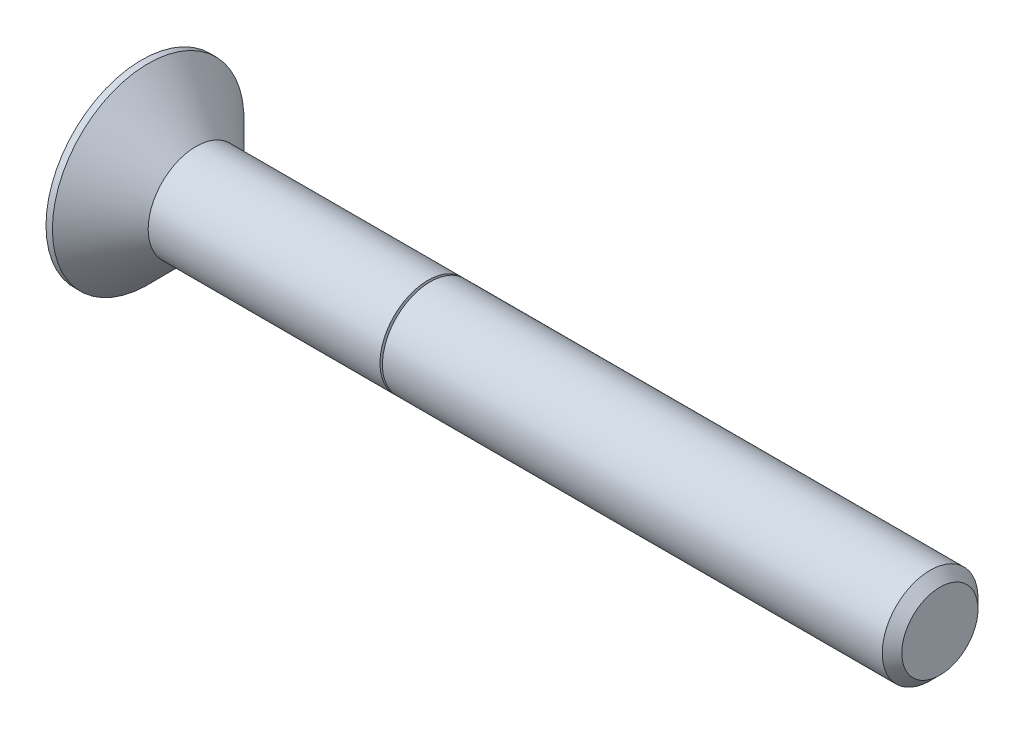
ISO-10303-21;
HEADER;
FILE_DESCRIPTION(('STEP AP214'),'2;1');
FILE_NAME('part.step','',(''),(''),'','','');
FILE_SCHEMA(('AUTOMOTIVE_DESIGN { 1 0 10303 214 1 1 1 1 }'));
ENDSEC;
DATA;
#1=APPLICATION_CONTEXT('core data for automotive mechanical design processes');
#2=APPLICATION_PROTOCOL_DEFINITION('international standard','automotive_design',2000,#1);
#3=PRODUCT_CONTEXT('',#1,'mechanical');
#4=PRODUCT('Part','Part','',(#3));
#5=PRODUCT_RELATED_PRODUCT_CATEGORY('part','',(#4));
#6=PRODUCT_DEFINITION_FORMATION('','',#4);
#7=PRODUCT_DEFINITION_CONTEXT('part definition',#1,'design');
#8=PRODUCT_DEFINITION('design','',#6,#7);
#9=PRODUCT_DEFINITION_SHAPE('','',#8);
#10=(LENGTH_UNIT() NAMED_UNIT(*) SI_UNIT(.MILLI.,.METRE.));
#11=(NAMED_UNIT(*) PLANE_ANGLE_UNIT() SI_UNIT($,.RADIAN.));
#12=(NAMED_UNIT(*) SI_UNIT($,.STERADIAN.) SOLID_ANGLE_UNIT());
#13=UNCERTAINTY_MEASURE_WITH_UNIT(LENGTH_MEASURE(1.E-05),#10,'distance_accuracy_value','');
#14=(GEOMETRIC_REPRESENTATION_CONTEXT(3) GLOBAL_UNCERTAINTY_ASSIGNED_CONTEXT((#13)) GLOBAL_UNIT_ASSIGNED_CONTEXT((#10,
#11,#12)) REPRESENTATION_CONTEXT('',''));
#15=CARTESIAN_POINT('',(0.,0.,0.));
#16=DIRECTION('',(0.,0.,1.));
#17=DIRECTION('',(1.,0.,0.));
#18=AXIS2_PLACEMENT_3D('',#15,#16,#17);
#19=CARTESIAN_POINT('',(1.19599999993625,0.,0.));
#20=DIRECTION('',(-1.,0.,0.));
#21=DIRECTION('',(0.,0.,1.));
#22=AXIS2_PLACEMENT_3D('',#19,#20,#21);
#23=CONICAL_SURFACE('',#22,1.16162874155634,1.04719755114781);
#24=CARTESIAN_POINT('',(1.19999999991991,2.55681404529271E-11,-1.15470053837725));
#25=CARTESIAN_POINT('',(1.21465222735329,0.0439439438040492,-1.12932949059931));
#26=CARTESIAN_POINT('',(1.22797766136562,0.0882672110816893,-1.10373944030185));
#27=CARTESIAN_POINT('',(1.25123680621567,0.17768117336278,-1.05211626510709));
#28=CARTESIAN_POINT('',(1.26116228974773,0.222773456562144,-1.02608222326447));
#29=CARTESIAN_POINT('',(1.27661202044451,0.312399216899071,-0.974336766408263));
#30=CARTESIAN_POINT('',(1.28223910611895,0.356918907827556,-0.94863331086623));
#31=CARTESIAN_POINT('',(1.28895541585153,0.446167660249827,-0.897105519630224));
#32=CARTESIAN_POINT('',(1.29005020292915,0.490896397571249,-0.871281371097252));
#33=CARTESIAN_POINT('',(1.28776685483754,0.57446724487014,-0.823031719912872));
#34=CARTESIAN_POINT('',(1.2849493573063,0.613321895334097,-0.800598977008224));
#35=CARTESIAN_POINT('',(1.27602134955453,0.690778070888351,-0.755879633201566));
#36=CARTESIAN_POINT('',(1.26990779252896,0.729379328278377,-0.73359318685638));
#37=CARTESIAN_POINT('',(1.25462508324365,0.806995070858899,-0.688781716984166));
#38=CARTESIAN_POINT('',(1.2453911788035,0.845999737685245,-0.666262362092323));
#39=CARTESIAN_POINT('',(1.22443411949278,0.923427484989556,-0.621559431343431));
#40=CARTESIAN_POINT('',(1.21271588553632,0.961851556641273,-0.59937528323195));
#41=CARTESIAN_POINT('',(1.19999999991243,0.999999999980699,-0.577350269200768));
#42=B_SPLINE_CURVE_WITH_KNOTS('',3,(#24,#25,#26,#27,#28,#29,#30,#31,#32,#33,#34,#35,#36,#37,#38,
#39,#40,#41),.UNSPECIFIED.,.F.,.F.,(4,2,2,2,2,2,2,2,4),(0.,0.15850800577775,0.317396908512481,
0.472353803074594,0.627120444446123,0.761853891302592,0.89671209687333,1.03456081120984,
1.17213898671229),.UNSPECIFIED.);
#43=CARTESIAN_POINT('',(1.19999999994811,1.08570198179951E-11,-1.15470053834804));
#44=VERTEX_POINT('',#43);
#45=CARTESIAN_POINT('',(1.19999999990961,1.,-0.5773502691771));
#46=VERTEX_POINT('',#45);
#47=EDGE_CURVE('E99',#44,#46,#42,.T.);
#48=ORIENTED_EDGE('',*,*,#47,.F.);
#49=CARTESIAN_POINT('',(1.19999999992372,-0.999999999989617,-0.577350269215681));
#50=CARTESIAN_POINT('',(1.21465222735454,-0.956056056201785,-0.602721316977984));
#51=CARTESIAN_POINT('',(1.22797766136577,-0.911732788920495,-0.628311367268926));
#52=CARTESIAN_POINT('',(1.25123680621498,-0.8223188266371,-0.679934542458689));
#53=CARTESIAN_POINT('',(1.26116228974729,-0.777226543439091,-0.705968584302857));
#54=CARTESIAN_POINT('',(1.2766120204443,-0.68760078310344,-0.757714041159983));
#55=CARTESIAN_POINT('',(1.28223910611871,-0.643081092174908,-0.783417496701443));
#56=CARTESIAN_POINT('',(1.28895541585138,-0.553832339752905,-0.834945287936858));
#57=CARTESIAN_POINT('',(1.29005020292912,-0.509103602431797,-0.860769436469812));
#58=CARTESIAN_POINT('',(1.28776685483773,-0.425532755132977,-0.909019087654253));
#59=CARTESIAN_POINT('',(1.28494935730656,-0.386678104668792,-0.931451830558998));
#60=CARTESIAN_POINT('',(1.27602134955489,-0.309221929114091,-0.976171174365888));
#61=CARTESIAN_POINT('',(1.26990779252935,-0.270620671723846,-0.998457620711209));
#62=CARTESIAN_POINT('',(1.25462508324406,-0.19300492914291,-1.04326909058367));
#63=CARTESIAN_POINT('',(1.2453911788039,-0.154000262316369,-1.06578844547562));
#64=CARTESIAN_POINT('',(1.22443411949315,-0.0765725150116841,-1.11049137622473));
#65=CARTESIAN_POINT('',(1.21271588553665,-0.0381484433597894,-1.13267552433631));
#66=CARTESIAN_POINT('',(1.19999999991272,-2.01907872125557E-11,-1.15470053836759));
#67=B_SPLINE_CURVE_WITH_KNOTS('',3,(#49,#50,#51,#52,#53,#54,#55,#56,#57,#58,#59,#60,#61,#62,#63,
#64,#65,#66),.UNSPECIFIED.,.F.,.F.,(4,2,2,2,2,2,2,2,4),(0.,0.158508005776644,0.317396908510391,
0.472353803071736,0.627120444442445,0.761853891299633,0.896712096871121,1.03456081120829,
1.17213898671135),.UNSPECIFIED.);
#68=CARTESIAN_POINT('',(1.19999999991322,-0.999999999989153,-0.577350269183364));
#69=VERTEX_POINT('',#68);
#70=EDGE_CURVE('E127',#69,#44,#67,.T.);
#71=ORIENTED_EDGE('',*,*,#70,.F.);
#72=CARTESIAN_POINT('',(1.19999999992372,-1.00000000001737,0.577350269167606));
#73=CARTESIAN_POINT('',(1.21465222735454,-1.00000000000624,0.526608173623716));
#74=CARTESIAN_POINT('',(1.22797766136577,-1.00000000000167,0.47542807303392));
#75=CARTESIAN_POINT('',(1.25123680621498,-0.999999999998324,0.372181722648594));
#76=CARTESIAN_POINT('',(1.26116228974729,-0.999999999999556,0.320113638962392));
#77=CARTESIAN_POINT('',(1.2766120204443,-1.00000000000043,0.216622725249659));
#78=CARTESIAN_POINT('',(1.28223910611871,-1.00000000000012,0.165215814166189));
#79=CARTESIAN_POINT('',(1.28895541585138,-0.999999999999885,0.0621602316949598));
#80=CARTESIAN_POINT('',(1.29005020292912,-0.999999999999971,0.0105119346292025));
#81=CARTESIAN_POINT('',(1.28776685483772,-1.00000000000002,-0.0859873677396719));
#82=CARTESIAN_POINT('',(1.28494935730655,-1.00000000000001,-0.130852853549281));
#83=CARTESIAN_POINT('',(1.27602134955485,-0.999999999999993,-0.220291541163256));
#84=CARTESIAN_POINT('',(1.26990779252929,-0.999999999999998,-0.264864433853975));
#85=CARTESIAN_POINT('',(1.25462508324395,-1.,-0.354487373599062));
#86=CARTESIAN_POINT('',(1.24539117880376,-1.,-0.399526083383059));
#87=CARTESIAN_POINT('',(1.22443411949293,-0.999999999999999,-0.488931944881441));
#88=CARTESIAN_POINT('',(1.2127158855364,-0.999999999999998,-0.53330024110469));
#89=CARTESIAN_POINT('',(1.19999999991243,-1.,-0.577350269167339));
#90=B_SPLINE_CURVE_WITH_KNOTS('',3,(#72,#73,#74,#75,#76,#77,#78,#79,#80,#81,#82,#83,#84,#85,#86,
#87,#88,#89),.UNSPECIFIED.,.F.,.F.,(4,2,2,2,2,2,2,2,4),(0.,0.158508005776645,0.317396908510393,
0.472353803071737,0.627120444442445,0.761853891299893,0.896712096871642,1.03456081120909,
1.17213898671242),.UNSPECIFIED.);
#91=CARTESIAN_POINT('',(1.19999999991322,-0.999999999989153,0.577350269183363));
#92=VERTEX_POINT('',#91);
#93=EDGE_CURVE('E166',#92,#69,#90,.T.);
#94=ORIENTED_EDGE('',*,*,#93,.F.);
#95=CARTESIAN_POINT('',(1.19999999991991,-2.55673927971802E-11,1.15470053837725));
#96=CARTESIAN_POINT('',(1.21465222735329,-0.0439439438040483,1.12932949059931));
#97=CARTESIAN_POINT('',(1.22797766136562,-0.0882672110816885,1.10373944030185));
#98=CARTESIAN_POINT('',(1.25123680621567,-0.177681173362779,1.05211626510709));
#99=CARTESIAN_POINT('',(1.26116228974773,-0.222773456562143,1.02608222326447));
#100=CARTESIAN_POINT('',(1.27661202044451,-0.31239921689907,0.974336766408263));
#101=CARTESIAN_POINT('',(1.28223910611895,-0.356918907827556,0.94863331086623));
#102=CARTESIAN_POINT('',(1.28895541585153,-0.446167660249826,0.897105519630224));
#103=CARTESIAN_POINT('',(1.29005020292915,-0.490896397571249,0.871281371097252));
#104=CARTESIAN_POINT('',(1.28776685483754,-0.57446724487014,0.823031719912872));
#105=CARTESIAN_POINT('',(1.2849493573063,-0.613321895334097,0.800598977008224));
#106=CARTESIAN_POINT('',(1.27602134955453,-0.690778070888351,0.755879633201566));
#107=CARTESIAN_POINT('',(1.26990779252896,-0.729379328278377,0.733593186856381));
#108=CARTESIAN_POINT('',(1.25462508324365,-0.806995070858899,0.688781716984166));
#109=CARTESIAN_POINT('',(1.2453911788035,-0.845999737685245,0.666262362092323));
#110=CARTESIAN_POINT('',(1.22443411949278,-0.923427484989556,0.621559431343431));
#111=CARTESIAN_POINT('',(1.21271588553632,-0.961851556641273,0.59937528323195));
#112=CARTESIAN_POINT('',(1.19999999991243,-0.999999999980699,0.577350269200769));
#113=B_SPLINE_CURVE_WITH_KNOTS('',3,(#95,#96,#97,#98,#99,#100,#101,#102,#103,#104,#105,#106,
#107,#108,#109,#110,#111,#112),.UNSPECIFIED.,.F.,.F.,(4,2,2,2,2,2,2,2,4),(0.,0.15850800577775,
0.317396908512481,0.472353803074594,0.627120444446123,0.761853891302593,0.89671209687333,
1.03456081120984,1.17213898671229),.UNSPECIFIED.);
#114=CARTESIAN_POINT('',(1.19999999992615,0.,1.15470053836475));
#115=VERTEX_POINT('',#114);
#116=EDGE_CURVE('E161',#115,#92,#113,.T.);
#117=ORIENTED_EDGE('',*,*,#116,.F.);
#118=CARTESIAN_POINT('',(1.19999999992372,0.999999999989618,0.577350269215681));
#119=CARTESIAN_POINT('',(1.21465222735454,0.956056056201785,0.602721316977984));
#120=CARTESIAN_POINT('',(1.22797766136577,0.911732788920496,0.628311367268926));
#121=CARTESIAN_POINT('',(1.25123680621498,0.8223188266371,0.679934542458689));
#122=CARTESIAN_POINT('',(1.26116228974729,0.777226543439092,0.705968584302857));
#123=CARTESIAN_POINT('',(1.2766120204443,0.68760078310344,0.757714041159982));
#124=CARTESIAN_POINT('',(1.28223910611871,0.643081092174908,0.783417496701443));
#125=CARTESIAN_POINT('',(1.28895541585138,0.553832339752905,0.834945287936858));
#126=CARTESIAN_POINT('',(1.29005020292912,0.509103602431797,0.860769436469812));
#127=CARTESIAN_POINT('',(1.28776685483773,0.425532755132978,0.909019087654252));
#128=CARTESIAN_POINT('',(1.28494935730656,0.386678104668792,0.931451830558998));
#129=CARTESIAN_POINT('',(1.27602134955489,0.309221929114091,0.976171174365888));
#130=CARTESIAN_POINT('',(1.26990779252935,0.270620671723847,0.998457620711209));
#131=CARTESIAN_POINT('',(1.25462508324406,0.193004929142911,1.04326909058367));
#132=CARTESIAN_POINT('',(1.2453911788039,0.15400026231637,1.06578844547562));
#133=CARTESIAN_POINT('',(1.22443411949315,0.0765725150116849,1.11049137622473));
#134=CARTESIAN_POINT('',(1.21271588553665,0.0381484433597902,1.13267552433631));
#135=CARTESIAN_POINT('',(1.19999999991272,2.01915067319781E-11,1.15470053836759));
#136=B_SPLINE_CURVE_WITH_KNOTS('',3,(#118,#119,#120,#121,#122,#123,#124,#125,#126,#127,#128,
#129,#130,#131,#132,#133,#134,#135),.UNSPECIFIED.,.F.,.F.,(4,2,2,2,2,2,2,2,4),(0.,
0.158508005776644,0.317396908510391,0.472353803071736,0.627120444442445,0.761853891299633,
0.896712096871121,1.03456081120829,1.17213898671135),.UNSPECIFIED.);
#137=CARTESIAN_POINT('',(1.19999999991322,0.999999999989153,0.577350269183363));
#138=VERTEX_POINT('',#137);
#139=EDGE_CURVE('E102',#138,#115,#136,.T.);
#140=ORIENTED_EDGE('',*,*,#139,.F.);
#141=CARTESIAN_POINT('',(1.19999999992372,1.00000000001737,-0.577350269167606));
#142=CARTESIAN_POINT('',(1.21465222735454,1.00000000000624,-0.526608173623716));
#143=CARTESIAN_POINT('',(1.22797766136577,1.00000000000167,-0.47542807303392));
#144=CARTESIAN_POINT('',(1.25123680621498,0.999999999998324,-0.372181722648594));
#145=CARTESIAN_POINT('',(1.26116228974729,0.999999999999556,-0.320113638962392));
#146=CARTESIAN_POINT('',(1.2766120204443,1.00000000000043,-0.216622725249659));
#147=CARTESIAN_POINT('',(1.28223910611871,1.00000000000012,-0.165215814166189));
#148=CARTESIAN_POINT('',(1.28895541585138,0.999999999999885,-0.0621602316949598));
#149=CARTESIAN_POINT('',(1.29005020292912,0.999999999999971,-0.0105119346292025));
#150=CARTESIAN_POINT('',(1.28776685483772,1.00000000000003,0.0859873677396717));
#151=CARTESIAN_POINT('',(1.28494935730655,1.00000000000001,0.130852853549281));
#152=CARTESIAN_POINT('',(1.27602134955485,0.999999999999993,0.220291541163256));
#153=CARTESIAN_POINT('',(1.26990779252929,0.999999999999998,0.264864433853975));
#154=CARTESIAN_POINT('',(1.25462508324395,1.,0.354487373599062));
#155=CARTESIAN_POINT('',(1.24539117880376,1.,0.399526083383059));
#156=CARTESIAN_POINT('',(1.22443411949293,0.999999999999999,0.488931944881441));
#157=CARTESIAN_POINT('',(1.2127158855364,0.999999999999998,0.53330024110469));
#158=CARTESIAN_POINT('',(1.19999999991243,1.,0.577350269167339));
#159=B_SPLINE_CURVE_WITH_KNOTS('',3,(#141,#142,#143,#144,#145,#146,#147,#148,#149,#150,#151,
#152,#153,#154,#155,#156,#157,#158),.UNSPECIFIED.,.F.,.F.,(4,2,2,2,2,2,2,2,4),(0.,
0.158508005776645,0.317396908510393,0.472353803071737,0.627120444442445,0.761853891299893,
0.896712096871642,1.03456081120909,1.17213898671242),.UNSPECIFIED.);
#160=EDGE_CURVE('E94',#46,#138,#159,.T.);
#161=ORIENTED_EDGE('',*,*,#160,.F.);
#162=EDGE_LOOP('',(#48,#71,#94,#117,#140,#161));
#163=FACE_BOUND('',#162,.T.);
#164=CARTESIAN_POINT('',(1.86666666658653,0.,-5.6843418860808E-11));
#165=VERTEX_POINT('',#164);
#166=VERTEX_LOOP('',#165);
#167=FACE_BOUND('',#166,.T.);
#168=ADVANCED_FACE('F43',(#163,#167),#23,.F.);
#169=CARTESIAN_POINT('',(1.7,1.,0.577350269189626));
#170=DIRECTION('',(0.,-1.,0.));
#171=DIRECTION('',(1.,0.,0.));
#172=AXIS2_PLACEMENT_3D('',#169,#170,#171);
#173=PLANE('',#172);
#174=ORIENTED_EDGE('',*,*,#160,.T.);
#175=DIRECTION('',(1.,0.,0.));
#176=VECTOR('',#175,1.);
#177=CARTESIAN_POINT('',(1.7,1.,0.577350269189626));
#178=LINE('',#177,#176);
#179=CARTESIAN_POINT('',(6.95928217736397E-12,1.00000000000603,0.577350269193106));
#180=VERTEX_POINT('',#179);
#181=EDGE_CURVE('E107',#180,#138,#178,.T.);
#182=ORIENTED_EDGE('',*,*,#181,.F.);
#183=DIRECTION('',(0.,0.,-1.));
#184=VECTOR('',#183,1.);
#185=CARTESIAN_POINT('',(0.,1.,0.577350269189625));
#186=LINE('',#185,#184);
#187=CARTESIAN_POINT('',(4.94925283621703E-12,1.00000000001206,-0.577350269186687));
#188=VERTEX_POINT('',#187);
#189=EDGE_CURVE('E115',#188,#180,#186,.F.);
#190=ORIENTED_EDGE('',*,*,#189,.F.);
#191=DIRECTION('',(1.,0.,0.));
#192=VECTOR('',#191,1.);
#193=CARTESIAN_POINT('',(1.7,1.,-0.577350269189625));
#194=LINE('',#193,#192);
#195=EDGE_CURVE('E112',#46,#188,#194,.F.);
#196=ORIENTED_EDGE('',*,*,#195,.F.);
#197=EDGE_LOOP('',(#174,#182,#190,#196));
#198=FACE_BOUND('',#197,.T.);
#199=ADVANCED_FACE('F113',(#198),#173,.T.);
#200=CARTESIAN_POINT('',(1.7,0.,1.15470053837925));
#201=DIRECTION('',(0.,-0.5,-0.866025403784439));
#202=DIRECTION('',(0.,0.866025403784439,-0.5));
#203=AXIS2_PLACEMENT_3D('',#200,#201,#202);
#204=PLANE('',#203);
#205=ORIENTED_EDGE('',*,*,#139,.T.);
#206=DIRECTION('',(1.,0.,0.));
#207=VECTOR('',#206,1.);
#208=CARTESIAN_POINT('',(1.7,0.,1.15470053837925));
#209=LINE('',#208,#207);
#210=CARTESIAN_POINT('',(6.958970591839E-12,0.,1.15470053838621));
#211=VERTEX_POINT('',#210);
#212=EDGE_CURVE('E201',#211,#115,#209,.T.);
#213=ORIENTED_EDGE('',*,*,#212,.F.);
#214=DIRECTION('',(0.,0.866025403784439,-0.5));
#215=VECTOR('',#214,1.);
#216=CARTESIAN_POINT('',(0.,0.,1.15470053837925));
#217=LINE('',#216,#215);
#218=EDGE_CURVE('E219',#180,#211,#217,.F.);
#219=ORIENTED_EDGE('',*,*,#218,.F.);
#220=ORIENTED_EDGE('',*,*,#181,.T.);
#221=EDGE_LOOP('',(#205,#213,#219,#220));
#222=FACE_BOUND('',#221,.T.);
#223=ADVANCED_FACE('F210',(#222),#204,.T.);
#224=CARTESIAN_POINT('',(1.7,-1.,0.577350269189625));
#225=DIRECTION('',(0.,0.5,-0.866025403784438));
#226=DIRECTION('',(0.,0.866025403784438,0.5));
#227=AXIS2_PLACEMENT_3D('',#224,#225,#226);
#228=PLANE('',#227);
#229=ORIENTED_EDGE('',*,*,#116,.T.);
#230=DIRECTION('',(1.,0.,0.));
#231=VECTOR('',#230,1.);
#232=CARTESIAN_POINT('',(1.7,-1.,0.577350269189626));
#233=LINE('',#232,#231);
#234=CARTESIAN_POINT('',(6.95941971837337E-12,-1.00000000000603,0.577350269193106));
#235=VERTEX_POINT('',#234);
#236=EDGE_CURVE('E173',#235,#92,#233,.T.);
#237=ORIENTED_EDGE('',*,*,#236,.F.);
#238=DIRECTION('',(0.,0.866025403784438,0.5));
#239=VECTOR('',#238,1.);
#240=CARTESIAN_POINT('',(0.,-1.,0.577350269189626));
#241=LINE('',#240,#239);
#242=EDGE_CURVE('E216',#211,#235,#241,.F.);
#243=ORIENTED_EDGE('',*,*,#242,.F.);
#244=ORIENTED_EDGE('',*,*,#212,.T.);
#245=EDGE_LOOP('',(#229,#237,#243,#244));
#246=FACE_BOUND('',#245,.T.);
#247=ADVANCED_FACE('F178',(#246),#228,.T.);
#248=CARTESIAN_POINT('',(1.7,-1.,-0.577350269189626));
#249=DIRECTION('',(0.,1.,0.));
#250=DIRECTION('',(0.,0.,1.));
#251=AXIS2_PLACEMENT_3D('',#248,#249,#250);
#252=PLANE('',#251);
#253=DIRECTION('',(1.,0.,0.));
#254=VECTOR('',#253,1.);
#255=CARTESIAN_POINT('',(1.7,-1.,-0.577350269189626));
#256=LINE('',#255,#254);
#257=CARTESIAN_POINT('',(6.95963026639509E-12,-1.00000000000603,-0.577350269193106));
#258=VERTEX_POINT('',#257);
#259=EDGE_CURVE('E172',#258,#69,#256,.T.);
#260=ORIENTED_EDGE('',*,*,#259,.F.);
#261=DIRECTION('',(0.,0.,-1.));
#262=VECTOR('',#261,1.);
#263=CARTESIAN_POINT('',(0.,-1.,1.5));
#264=LINE('',#263,#262);
#265=EDGE_CURVE('E218',#258,#235,#264,.F.);
#266=ORIENTED_EDGE('',*,*,#265,.T.);
#267=ORIENTED_EDGE('',*,*,#236,.T.);
#268=ORIENTED_EDGE('',*,*,#93,.T.);
#269=EDGE_LOOP('',(#260,#266,#267,#268));
#270=FACE_BOUND('',#269,.T.);
#271=ADVANCED_FACE('F174',(#270),#252,.T.);
#272=CARTESIAN_POINT('',(1.7,0.,-1.15470053837925));
#273=DIRECTION('',(0.,0.5,0.866025403784439));
#274=DIRECTION('',(0.,-0.866025403784439,0.5));
#275=AXIS2_PLACEMENT_3D('',#272,#273,#274);
#276=PLANE('',#275);
#277=DIRECTION('',(1.,0.,0.));
#278=VECTOR('',#277,1.);
#279=CARTESIAN_POINT('',(1.7,0.,-1.15470053837925));
#280=LINE('',#279,#278);
#281=CARTESIAN_POINT('',(6.95971261690438E-12,0.,-1.15470053838621));
#282=VERTEX_POINT('',#281);
#283=EDGE_CURVE('E122',#282,#44,#280,.T.);
#284=ORIENTED_EDGE('',*,*,#283,.F.);
#285=DIRECTION('',(0.,0.866025403784439,-0.5));
#286=VECTOR('',#285,1.);
#287=CARTESIAN_POINT('',(0.,-1.14951905283833,-0.49102540378444));
#288=LINE('',#287,#286);
#289=EDGE_CURVE('E60',#282,#258,#288,.F.);
#290=ORIENTED_EDGE('',*,*,#289,.T.);
#291=ORIENTED_EDGE('',*,*,#259,.T.);
#292=ORIENTED_EDGE('',*,*,#70,.T.);
#293=EDGE_LOOP('',(#284,#290,#291,#292));
#294=FACE_BOUND('',#293,.T.);
#295=ADVANCED_FACE('F177',(#294),#276,.T.);
#296=CARTESIAN_POINT('',(1.7,1.,-0.577350269189625));
#297=DIRECTION('',(0.,-0.500000000000001,0.866025403784438));
#298=DIRECTION('',(0.,-0.866025403784438,-0.500000000000001));
#299=AXIS2_PLACEMENT_3D('',#296,#297,#298);
#300=PLANE('',#299);
#301=ORIENTED_EDGE('',*,*,#195,.T.);
#302=DIRECTION('',(0.,0.866025403784438,0.500000000000001));
#303=VECTOR('',#302,1.);
#304=CARTESIAN_POINT('',(0.,1.14951905283833,-0.491025403784437));
#305=LINE('',#304,#303);
#306=EDGE_CURVE('E223',#188,#282,#305,.F.);
#307=ORIENTED_EDGE('',*,*,#306,.T.);
#308=ORIENTED_EDGE('',*,*,#283,.T.);
#309=ORIENTED_EDGE('',*,*,#47,.T.);
#310=EDGE_LOOP('',(#301,#307,#308,#309));
#311=FACE_BOUND('',#310,.T.);
#312=ADVANCED_FACE('F120',(#311),#300,.T.);
#313=CARTESIAN_POINT('',(0.,0.,1.5));
#314=DIRECTION('',(-1.,0.,0.));
#315=DIRECTION('',(0.,0.,1.));
#316=AXIS2_PLACEMENT_3D('',#313,#314,#315);
#317=PLANE('',#316);
#318=CARTESIAN_POINT('',(0.,0.,0.));
#319=DIRECTION('',(-1.,0.,0.));
#320=DIRECTION('',(0.,0.,1.));
#321=AXIS2_PLACEMENT_3D('',#318,#319,#320);
#322=CIRCLE('',#321,3.);
#323=CARTESIAN_POINT('',(0.,0.,3.));
#324=VERTEX_POINT('',#323);
#325=EDGE_CURVE('E118',#324,#324,#322,.F.);
#326=ORIENTED_EDGE('',*,*,#325,.F.);
#327=EDGE_LOOP('',(#326));
#328=FACE_BOUND('',#327,.T.);
#329=ORIENTED_EDGE('',*,*,#242,.T.);
#330=ORIENTED_EDGE('',*,*,#265,.F.);
#331=ORIENTED_EDGE('',*,*,#289,.F.);
#332=ORIENTED_EDGE('',*,*,#306,.F.);
#333=ORIENTED_EDGE('',*,*,#189,.T.);
#334=ORIENTED_EDGE('',*,*,#218,.T.);
#335=EDGE_LOOP('',(#329,#330,#331,#332,#333,#334));
#336=FACE_BOUND('',#335,.T.);
#337=ADVANCED_FACE('F221',(#328,#336),#317,.T.);
#338=CARTESIAN_POINT('',(0.1,0.,0.));
#339=DIRECTION('',(-1.,0.,0.));
#340=DIRECTION('',(0.,0.,1.));
#341=AXIS2_PLACEMENT_3D('',#338,#339,#340);
#342=CYLINDRICAL_SURFACE('',#341,3.);
#343=ORIENTED_EDGE('',*,*,#325,.T.);
#344=EDGE_LOOP('',(#343));
#345=FACE_BOUND('',#344,.T.);
#346=CARTESIAN_POINT('',(0.200000000063483,0.,0.));
#347=DIRECTION('',(-1.,0.,0.));
#348=DIRECTION('',(0.,0.,1.));
#349=AXIS2_PLACEMENT_3D('',#346,#347,#348);
#350=CIRCLE('',#349,2.9999999999859);
#351=CARTESIAN_POINT('',(0.200000000063483,0.,2.9999999999859));
#352=VERTEX_POINT('',#351);
#353=EDGE_CURVE('E274',#352,#352,#350,.F.);
#354=ORIENTED_EDGE('',*,*,#353,.F.);
#355=EDGE_LOOP('',(#354));
#356=FACE_BOUND('',#355,.T.);
#357=ADVANCED_FACE('F262',(#345,#356),#342,.T.);
#358=CARTESIAN_POINT('',(0.200000000063483,0.,0.));
#359=DIRECTION('',(-1.,0.,0.));
#360=DIRECTION('',(0.,0.,1.));
#361=AXIS2_PLACEMENT_3D('',#358,#359,#360);
#362=CONICAL_SURFACE('',#361,2.9999999999859,0.785398163416396);
#363=ORIENTED_EDGE('',*,*,#353,.T.);
#364=EDGE_LOOP('',(#363));
#365=FACE_BOUND('',#364,.T.);
#366=CARTESIAN_POINT('',(1.7,0.,0.));
#367=DIRECTION('',(1.,0.,0.));
#368=DIRECTION('',(0.,0.,-1.));
#369=AXIS2_PLACEMENT_3D('',#366,#367,#368);
#370=CIRCLE('',#369,1.5);
#371=CARTESIAN_POINT('',(1.7,0.,-1.5));
#372=VERTEX_POINT('',#371);
#373=EDGE_CURVE('E278',#372,#372,#370,.T.);
#374=ORIENTED_EDGE('',*,*,#373,.F.);
#375=EDGE_LOOP('',(#374));
#376=FACE_BOUND('',#375,.T.);
#377=ADVANCED_FACE('F258',(#365,#376),#362,.T.);
#378=CARTESIAN_POINT('',(4.5,0.,0.));
#379=DIRECTION('',(1.,0.,0.));
#380=DIRECTION('',(0.,0.,-1.));
#381=AXIS2_PLACEMENT_3D('',#378,#379,#380);
#382=CYLINDRICAL_SURFACE('',#381,1.5);
#383=CARTESIAN_POINT('',(8.96168749999759,0.,0.));
#384=DIRECTION('',(-1.,0.,0.));
#385=DIRECTION('',(0.,0.,-1.));
#386=AXIS2_PLACEMENT_3D('',#383,#384,#385);
#387=CIRCLE('',#386,1.50000000002137);
#388=CARTESIAN_POINT('',(8.96168749999759,0.,-1.50000000002137));
#389=VERTEX_POINT('',#388);
#390=EDGE_CURVE('E284',#389,#389,#387,.T.);
#391=ORIENTED_EDGE('',*,*,#390,.T.);
#392=EDGE_LOOP('',(#391));
#393=FACE_BOUND('',#392,.T.);
#394=ORIENTED_EDGE('',*,*,#373,.T.);
#395=EDGE_LOOP('',(#394));
#396=FACE_BOUND('',#395,.T.);
#397=ADVANCED_FACE('F250',(#393,#396),#382,.T.);
#398=CARTESIAN_POINT('',(9.00000000002166,0.,0.));
#399=DIRECTION('',(-1.,0.,0.));
#400=DIRECTION('',(0.,0.,1.));
#401=AXIS2_PLACEMENT_3D('',#398,#399,#400);
#402=CONICAL_SURFACE('',#401,1.19349999982887,1.44644133224814);
#403=ORIENTED_EDGE('',*,*,#390,.F.);
#404=EDGE_LOOP('',(#403));
#405=FACE_BOUND('',#404,.T.);
#406=CARTESIAN_POINT('',(8.99999999999324,0.,0.));
#407=DIRECTION('',(1.,0.,0.));
#408=DIRECTION('',(0.,0.,-1.));
#409=AXIS2_PLACEMENT_3D('',#406,#407,#408);
#410=CIRCLE('',#409,1.1934999999994);
#411=CARTESIAN_POINT('',(8.99999999999324,0.,-1.1934999999994));
#412=VERTEX_POINT('',#411);
#413=EDGE_CURVE('E293',#412,#412,#410,.F.);
#414=ORIENTED_EDGE('',*,*,#413,.T.);
#415=EDGE_LOOP('',(#414));
#416=FACE_BOUND('',#415,.T.);
#417=ADVANCED_FACE('F241',(#405,#416),#402,.T.);
#418=CARTESIAN_POINT('',(8.99999999998613,0.,0.));
#419=DIRECTION('',(1.,0.,0.));
#420=DIRECTION('',(0.,0.,-1.));
#421=AXIS2_PLACEMENT_3D('',#418,#419,#420);
#422=CONICAL_SURFACE('',#421,1.19349999994256,1.44644133224814);
#423=ORIENTED_EDGE('',*,*,#413,.F.);
#424=EDGE_LOOP('',(#423));
#425=FACE_BOUND('',#424,.T.);
#426=CARTESIAN_POINT('',(9.0383125,0.,0.));
#427=DIRECTION('',(1.,0.,0.));
#428=DIRECTION('',(0.,0.,-1.));
#429=AXIS2_PLACEMENT_3D('',#426,#427,#428);
#430=CIRCLE('',#429,1.5);
#431=CARTESIAN_POINT('',(9.0383125,0.,-1.5));
#432=VERTEX_POINT('',#431);
#433=EDGE_CURVE('E108',#432,#432,#430,.T.);
#434=ORIENTED_EDGE('',*,*,#433,.F.);
#435=EDGE_LOOP('',(#434));
#436=FACE_BOUND('',#435,.T.);
#437=ADVANCED_FACE('F239',(#425,#436),#422,.T.);
#438=CARTESIAN_POINT('',(25.,0.,0.));
#439=DIRECTION('',(-1.,0.,0.));
#440=DIRECTION('',(0.,0.,1.));
#441=AXIS2_PLACEMENT_3D('',#438,#439,#440);
#442=CYLINDRICAL_SURFACE('',#441,1.5);
#443=CARTESIAN_POINT('',(24.6935000000977,0.,0.));
#444=DIRECTION('',(1.,0.,0.));
#445=DIRECTION('',(0.,0.,-1.));
#446=AXIS2_PLACEMENT_3D('',#443,#444,#445);
#447=CIRCLE('',#446,1.5);
#448=CARTESIAN_POINT('',(24.6935000000977,0.,-1.5));
#449=VERTEX_POINT('',#448);
#450=EDGE_CURVE('E13',#449,#449,#447,.F.);
#451=ORIENTED_EDGE('',*,*,#450,.T.);
#452=EDGE_LOOP('',(#451));
#453=FACE_BOUND('',#452,.T.);
#454=ORIENTED_EDGE('',*,*,#433,.T.);
#455=EDGE_LOOP('',(#454));
#456=FACE_BOUND('',#455,.T.);
#457=ADVANCED_FACE('F148',(#453,#456),#442,.T.);
#458=CARTESIAN_POINT('',(25.,0.,0.));
#459=DIRECTION('',(1.,0.,0.));
#460=DIRECTION('',(0.,0.,-1.));
#461=AXIS2_PLACEMENT_3D('',#458,#459,#460);
#462=PLANE('',#461);
#463=CARTESIAN_POINT('',(25.,0.,0.));
#464=DIRECTION('',(1.,0.,0.));
#465=DIRECTION('',(0.,0.,-1.));
#466=AXIS2_PLACEMENT_3D('',#463,#464,#465);
#467=CIRCLE('',#466,1.19350000009767);
#468=CARTESIAN_POINT('',(25.,0.,-1.19350000009766));
#469=VERTEX_POINT('',#468);
#470=EDGE_CURVE('E52',#469,#469,#467,.T.);
#471=ORIENTED_EDGE('',*,*,#470,.T.);
#472=EDGE_LOOP('',(#471));
#473=FACE_BOUND('',#472,.T.);
#474=ADVANCED_FACE('F230',(#473),#462,.T.);
#475=CARTESIAN_POINT('',(25.,0.,0.));
#476=DIRECTION('',(-1.,0.,0.));
#477=DIRECTION('',(0.,0.,1.));
#478=AXIS2_PLACEMENT_3D('',#475,#476,#477);
#479=CONICAL_SURFACE('',#478,1.19350000009767,0.785398163397445);
#480=ORIENTED_EDGE('',*,*,#450,.F.);
#481=EDGE_LOOP('',(#480));
#482=FACE_BOUND('',#481,.T.);
#483=ORIENTED_EDGE('',*,*,#470,.F.);
#484=EDGE_LOOP('',(#483));
#485=FACE_BOUND('',#484,.T.);
#486=ADVANCED_FACE('F45',(#482,#485),#479,.T.);
#487=CLOSED_SHELL('',(#168,#199,#223,#247,#271,#295,#312,#337,#357,#377,#397,#417,#437,#457,
#474,#486));
#488=MANIFOLD_SOLID_BREP('B2',#487);
#489=ADVANCED_BREP_SHAPE_REPRESENTATION('',(#18,#488),#14);
#490=SHAPE_DEFINITION_REPRESENTATION(#9,#489);
ENDSEC;
END-ISO-10303-21;
